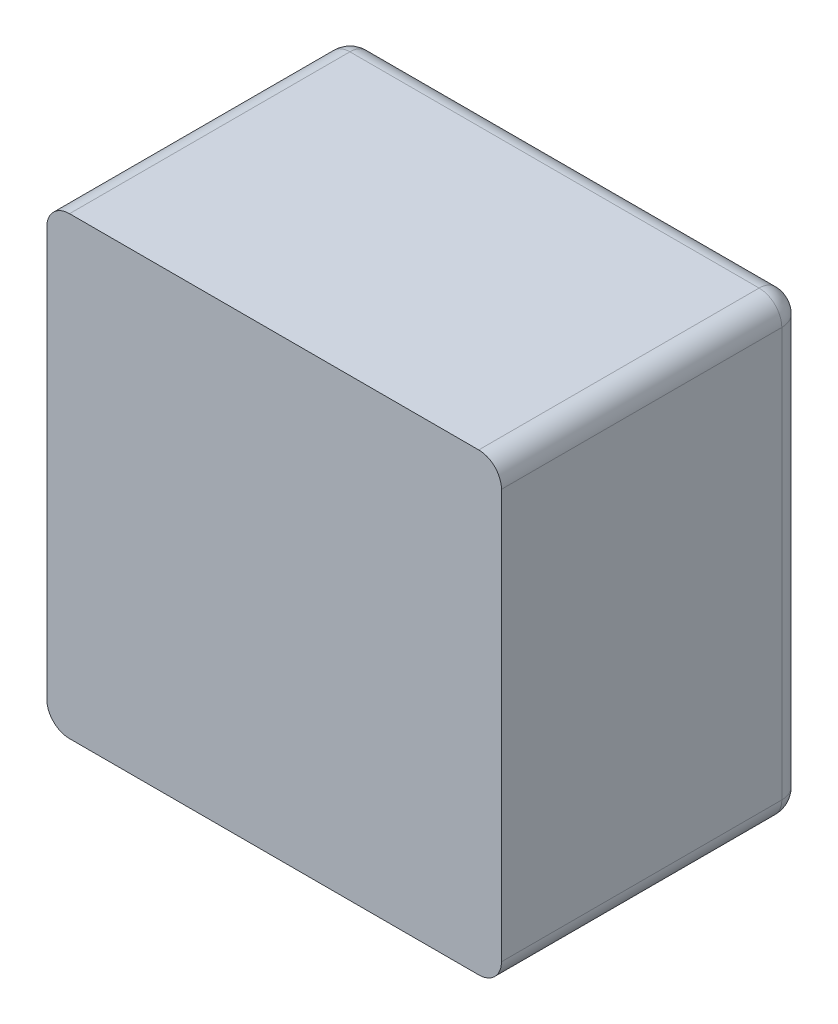
ISO-10303-21;
HEADER;
FILE_DESCRIPTION(('STEP AP214'),'2;1');
FILE_NAME('part.step','',(''),(''),'','','');
FILE_SCHEMA(('AUTOMOTIVE_DESIGN { 1 0 10303 214 1 1 1 1 }'));
ENDSEC;
DATA;
#1=APPLICATION_CONTEXT('core data for automotive mechanical design processes');
#2=APPLICATION_PROTOCOL_DEFINITION('international standard','automotive_design',2000,#1);
#3=PRODUCT_CONTEXT('',#1,'mechanical');
#4=PRODUCT('Part','Part','',(#3));
#5=PRODUCT_RELATED_PRODUCT_CATEGORY('part','',(#4));
#6=PRODUCT_DEFINITION_FORMATION('','',#4);
#7=PRODUCT_DEFINITION_CONTEXT('part definition',#1,'design');
#8=PRODUCT_DEFINITION('design','',#6,#7);
#9=PRODUCT_DEFINITION_SHAPE('','',#8);
#10=(LENGTH_UNIT() NAMED_UNIT(*) SI_UNIT(.MILLI.,.METRE.));
#11=(NAMED_UNIT(*) PLANE_ANGLE_UNIT() SI_UNIT($,.RADIAN.));
#12=(NAMED_UNIT(*) SI_UNIT($,.STERADIAN.) SOLID_ANGLE_UNIT());
#13=UNCERTAINTY_MEASURE_WITH_UNIT(LENGTH_MEASURE(1.E-05),#10,'distance_accuracy_value','');
#14=(GEOMETRIC_REPRESENTATION_CONTEXT(3) GLOBAL_UNCERTAINTY_ASSIGNED_CONTEXT((#13)) GLOBAL_UNIT_ASSIGNED_CONTEXT((#10,
#11,#12)) REPRESENTATION_CONTEXT('',''));
#15=CARTESIAN_POINT('',(0.,0.,0.));
#16=DIRECTION('',(0.,0.,1.));
#17=DIRECTION('',(1.,0.,0.));
#18=AXIS2_PLACEMENT_3D('',#15,#16,#17);
#19=CARTESIAN_POINT('',(-25.,26.5625,40.));
#20=DIRECTION('',(1.,0.,0.));
#21=DIRECTION('',(0.,1.,0.));
#22=AXIS2_PLACEMENT_3D('',#19,#20,#21);
#23=PLANE('',#22);
#24=DIRECTION('',(0.,0.,-1.));
#25=VECTOR('',#24,1.);
#26=CARTESIAN_POINT('',(-25.,23.5625,40.));
#27=LINE('',#26,#25);
#28=CARTESIAN_POINT('',(-25.,23.5625,40.));
#29=VERTEX_POINT('',#28);
#30=CARTESIAN_POINT('',(-25.,23.5625,3.));
#31=VERTEX_POINT('',#30);
#32=EDGE_CURVE('E121',#29,#31,#27,.T.);
#33=ORIENTED_EDGE('',*,*,#32,.T.);
#34=DIRECTION('',(0.,-1.,0.));
#35=VECTOR('',#34,1.);
#36=CARTESIAN_POINT('',(-25.,26.5625,3.));
#37=LINE('',#36,#35);
#38=CARTESIAN_POINT('',(-25.,-30.4375,3.));
#39=VERTEX_POINT('',#38);
#40=EDGE_CURVE('E171',#31,#39,#37,.T.);
#41=ORIENTED_EDGE('',*,*,#40,.T.);
#42=DIRECTION('',(0.,0.,-1.));
#43=VECTOR('',#42,1.);
#44=CARTESIAN_POINT('',(-25.,-30.4375,40.));
#45=LINE('',#44,#43);
#46=CARTESIAN_POINT('',(-25.,-30.4375,40.));
#47=VERTEX_POINT('',#46);
#48=EDGE_CURVE('E148',#39,#47,#45,.F.);
#49=ORIENTED_EDGE('',*,*,#48,.T.);
#50=DIRECTION('',(0.,-1.,0.));
#51=VECTOR('',#50,1.);
#52=CARTESIAN_POINT('',(-25.,26.5625,40.));
#53=LINE('',#52,#51);
#54=EDGE_CURVE('E200',#29,#47,#53,.T.);
#55=ORIENTED_EDGE('',*,*,#54,.F.);
#56=EDGE_LOOP('',(#33,#41,#49,#55));
#57=FACE_BOUND('',#56,.T.);
#58=ADVANCED_FACE('F34',(#57),#23,.F.);
#59=CARTESIAN_POINT('',(-25.,-33.4375,40.));
#60=DIRECTION('',(0.,1.,0.));
#61=DIRECTION('',(0.,0.,1.));
#62=AXIS2_PLACEMENT_3D('',#59,#60,#61);
#63=PLANE('',#62);
#64=DIRECTION('',(0.,0.,-1.));
#65=VECTOR('',#64,1.);
#66=CARTESIAN_POINT('',(-22.,-33.4375,40.));
#67=LINE('',#66,#65);
#68=CARTESIAN_POINT('',(-22.,-33.4375,40.));
#69=VERTEX_POINT('',#68);
#70=CARTESIAN_POINT('',(-22.,-33.4375,3.));
#71=VERTEX_POINT('',#70);
#72=EDGE_CURVE('E133',#69,#71,#67,.T.);
#73=ORIENTED_EDGE('',*,*,#72,.T.);
#74=DIRECTION('',(1.,0.,0.));
#75=VECTOR('',#74,1.);
#76=CARTESIAN_POINT('',(-25.,-33.4375,3.));
#77=LINE('',#76,#75);
#78=CARTESIAN_POINT('',(32.,-33.4375,3.));
#79=VERTEX_POINT('',#78);
#80=EDGE_CURVE('E58',#71,#79,#77,.T.);
#81=ORIENTED_EDGE('',*,*,#80,.T.);
#82=DIRECTION('',(0.,0.,-1.));
#83=VECTOR('',#82,1.);
#84=CARTESIAN_POINT('',(32.,-33.4375,40.));
#85=LINE('',#84,#83);
#86=CARTESIAN_POINT('',(32.,-33.4375,40.));
#87=VERTEX_POINT('',#86);
#88=EDGE_CURVE('E135',#79,#87,#85,.F.);
#89=ORIENTED_EDGE('',*,*,#88,.T.);
#90=DIRECTION('',(1.,0.,0.));
#91=VECTOR('',#90,1.);
#92=CARTESIAN_POINT('',(-25.,-33.4375,40.));
#93=LINE('',#92,#91);
#94=EDGE_CURVE('E120',#69,#87,#93,.T.);
#95=ORIENTED_EDGE('',*,*,#94,.F.);
#96=EDGE_LOOP('',(#73,#81,#89,#95));
#97=FACE_BOUND('',#96,.T.);
#98=ADVANCED_FACE('F258',(#97),#63,.F.);
#99=CARTESIAN_POINT('',(35.,26.5625,40.));
#100=DIRECTION('',(-1.,0.,0.));
#101=DIRECTION('',(0.,-1.,0.));
#102=AXIS2_PLACEMENT_3D('',#99,#100,#101);
#103=PLANE('',#102);
#104=DIRECTION('',(0.,0.,-1.));
#105=VECTOR('',#104,1.);
#106=CARTESIAN_POINT('',(35.,-30.4375,40.));
#107=LINE('',#106,#105);
#108=CARTESIAN_POINT('',(35.,-30.4375,40.));
#109=VERTEX_POINT('',#108);
#110=CARTESIAN_POINT('',(35.,-30.4375,3.));
#111=VERTEX_POINT('',#110);
#112=EDGE_CURVE('E126',#109,#111,#107,.T.);
#113=ORIENTED_EDGE('',*,*,#112,.T.);
#114=DIRECTION('',(0.,1.,0.));
#115=VECTOR('',#114,1.);
#116=CARTESIAN_POINT('',(35.,26.5625,3.));
#117=LINE('',#116,#115);
#118=CARTESIAN_POINT('',(35.,23.5625,3.));
#119=VERTEX_POINT('',#118);
#120=EDGE_CURVE('E11',#111,#119,#117,.T.);
#121=ORIENTED_EDGE('',*,*,#120,.T.);
#122=DIRECTION('',(0.,0.,-1.));
#123=VECTOR('',#122,1.);
#124=CARTESIAN_POINT('',(35.,23.5625,40.));
#125=LINE('',#124,#123);
#126=CARTESIAN_POINT('',(35.,23.5625,40.));
#127=VERTEX_POINT('',#126);
#128=EDGE_CURVE('E129',#119,#127,#125,.F.);
#129=ORIENTED_EDGE('',*,*,#128,.T.);
#130=DIRECTION('',(0.,1.,0.));
#131=VECTOR('',#130,1.);
#132=CARTESIAN_POINT('',(35.,26.5625,40.));
#133=LINE('',#132,#131);
#134=EDGE_CURVE('E117',#109,#127,#133,.T.);
#135=ORIENTED_EDGE('',*,*,#134,.F.);
#136=EDGE_LOOP('',(#113,#121,#129,#135));
#137=FACE_BOUND('',#136,.T.);
#138=ADVANCED_FACE('F125',(#137),#103,.F.);
#139=CARTESIAN_POINT('',(-25.,26.5625,40.));
#140=DIRECTION('',(0.,-1.,0.));
#141=DIRECTION('',(0.,0.,-1.));
#142=AXIS2_PLACEMENT_3D('',#139,#140,#141);
#143=PLANE('',#142);
#144=DIRECTION('',(0.,0.,-1.));
#145=VECTOR('',#144,1.);
#146=CARTESIAN_POINT('',(32.,26.5625,40.));
#147=LINE('',#146,#145);
#148=CARTESIAN_POINT('',(32.,26.5625,40.));
#149=VERTEX_POINT('',#148);
#150=CARTESIAN_POINT('',(32.,26.5625,3.));
#151=VERTEX_POINT('',#150);
#152=EDGE_CURVE('E150',#149,#151,#147,.T.);
#153=ORIENTED_EDGE('',*,*,#152,.T.);
#154=DIRECTION('',(-1.,0.,0.));
#155=VECTOR('',#154,1.);
#156=CARTESIAN_POINT('',(-25.,26.5625,3.));
#157=LINE('',#156,#155);
#158=CARTESIAN_POINT('',(-22.,26.5625,3.));
#159=VERTEX_POINT('',#158);
#160=EDGE_CURVE('E158',#151,#159,#157,.T.);
#161=ORIENTED_EDGE('',*,*,#160,.T.);
#162=DIRECTION('',(0.,0.,-1.));
#163=VECTOR('',#162,1.);
#164=CARTESIAN_POINT('',(-22.,26.5625,40.));
#165=LINE('',#164,#163);
#166=CARTESIAN_POINT('',(-22.,26.5625,40.));
#167=VERTEX_POINT('',#166);
#168=EDGE_CURVE('E153',#159,#167,#165,.F.);
#169=ORIENTED_EDGE('',*,*,#168,.T.);
#170=DIRECTION('',(-1.,0.,0.));
#171=VECTOR('',#170,1.);
#172=CARTESIAN_POINT('',(-25.,26.5625,40.));
#173=LINE('',#172,#171);
#174=EDGE_CURVE('E130',#149,#167,#173,.T.);
#175=ORIENTED_EDGE('',*,*,#174,.F.);
#176=EDGE_LOOP('',(#153,#161,#169,#175));
#177=FACE_BOUND('',#176,.T.);
#178=ADVANCED_FACE('F250',(#177),#143,.F.);
#179=CARTESIAN_POINT('',(0.,0.,40.));
#180=DIRECTION('',(0.,0.,1.));
#181=DIRECTION('',(1.,0.,0.));
#182=AXIS2_PLACEMENT_3D('',#179,#180,#181);
#183=PLANE('',#182);
#184=ORIENTED_EDGE('',*,*,#94,.T.);
#185=CARTESIAN_POINT('',(32.,-30.4375,40.));
#186=DIRECTION('',(0.,0.,1.));
#187=DIRECTION('',(1.,0.,0.));
#188=AXIS2_PLACEMENT_3D('',#185,#186,#187);
#189=CIRCLE('',#188,3.);
#190=EDGE_CURVE('E114',#87,#109,#189,.T.);
#191=ORIENTED_EDGE('',*,*,#190,.T.);
#192=ORIENTED_EDGE('',*,*,#134,.T.);
#193=CARTESIAN_POINT('',(32.,23.5625,40.));
#194=DIRECTION('',(0.,0.,1.));
#195=DIRECTION('',(1.,0.,0.));
#196=AXIS2_PLACEMENT_3D('',#193,#194,#195);
#197=CIRCLE('',#196,3.);
#198=EDGE_CURVE('E141',#127,#149,#197,.T.);
#199=ORIENTED_EDGE('',*,*,#198,.T.);
#200=ORIENTED_EDGE('',*,*,#174,.T.);
#201=CARTESIAN_POINT('',(-22.,23.5625,40.));
#202=DIRECTION('',(0.,0.,1.));
#203=DIRECTION('',(1.,0.,0.));
#204=AXIS2_PLACEMENT_3D('',#201,#202,#203);
#205=CIRCLE('',#204,3.);
#206=EDGE_CURVE('E143',#167,#29,#205,.T.);
#207=ORIENTED_EDGE('',*,*,#206,.T.);
#208=ORIENTED_EDGE('',*,*,#54,.T.);
#209=CARTESIAN_POINT('',(-22.,-30.4375,40.));
#210=DIRECTION('',(0.,0.,1.));
#211=DIRECTION('',(1.,0.,0.));
#212=AXIS2_PLACEMENT_3D('',#209,#210,#211);
#213=CIRCLE('',#212,3.);
#214=EDGE_CURVE('E122',#47,#69,#213,.T.);
#215=ORIENTED_EDGE('',*,*,#214,.T.);
#216=EDGE_LOOP('',(#184,#191,#192,#199,#200,#207,#208,#215));
#217=FACE_BOUND('',#216,.T.);
#218=ADVANCED_FACE('F116',(#217),#183,.T.);
#219=CARTESIAN_POINT('',(0.,0.,0.));
#220=DIRECTION('',(0.,0.,1.));
#221=DIRECTION('',(1.,0.,0.));
#222=AXIS2_PLACEMENT_3D('',#219,#220,#221);
#223=PLANE('',#222);
#224=CARTESIAN_POINT('',(5.00000000000002,-3.4375,0.));
#225=DIRECTION('',(0.,0.,-1.));
#226=DIRECTION('',(-1.,0.,0.));
#227=AXIS2_PLACEMENT_3D('',#224,#225,#226);
#228=CIRCLE('',#227,20.);
#229=CARTESIAN_POINT('',(-15.,-3.4375,0.));
#230=VERTEX_POINT('',#229);
#231=EDGE_CURVE('E210',#230,#230,#228,.T.);
#232=ORIENTED_EDGE('',*,*,#231,.F.);
#233=EDGE_LOOP('',(#232));
#234=FACE_BOUND('',#233,.T.);
#235=DIRECTION('',(0.,-1.,0.));
#236=VECTOR('',#235,1.);
#237=CARTESIAN_POINT('',(-22.,0.,0.));
#238=LINE('',#237,#236);
#239=CARTESIAN_POINT('',(-22.,-30.4375,0.));
#240=VERTEX_POINT('',#239);
#241=CARTESIAN_POINT('',(-22.,23.5625,0.));
#242=VERTEX_POINT('',#241);
#243=EDGE_CURVE('E164',#240,#242,#238,.F.);
#244=ORIENTED_EDGE('',*,*,#243,.T.);
#245=DIRECTION('',(-1.,0.,0.));
#246=VECTOR('',#245,1.);
#247=CARTESIAN_POINT('',(0.,23.5625,0.));
#248=LINE('',#247,#246);
#249=CARTESIAN_POINT('',(32.,23.5625,0.));
#250=VERTEX_POINT('',#249);
#251=EDGE_CURVE('E166',#242,#250,#248,.F.);
#252=ORIENTED_EDGE('',*,*,#251,.T.);
#253=DIRECTION('',(0.,1.,0.));
#254=VECTOR('',#253,1.);
#255=CARTESIAN_POINT('',(32.,0.,0.));
#256=LINE('',#255,#254);
#257=CARTESIAN_POINT('',(32.,-30.4375,0.));
#258=VERTEX_POINT('',#257);
#259=EDGE_CURVE('E160',#250,#258,#256,.F.);
#260=ORIENTED_EDGE('',*,*,#259,.T.);
#261=DIRECTION('',(1.,0.,0.));
#262=VECTOR('',#261,1.);
#263=CARTESIAN_POINT('',(0.,-30.4375,0.));
#264=LINE('',#263,#262);
#265=EDGE_CURVE('E162',#258,#240,#264,.F.);
#266=ORIENTED_EDGE('',*,*,#265,.T.);
#267=EDGE_LOOP('',(#244,#252,#260,#266));
#268=FACE_BOUND('',#267,.T.);
#269=ADVANCED_FACE('F236',(#234,#268),#223,.F.);
#270=CARTESIAN_POINT('',(32.,-30.4375,40.));
#271=DIRECTION('',(0.,0.,-1.));
#272=DIRECTION('',(-1.,0.,0.));
#273=AXIS2_PLACEMENT_3D('',#270,#271,#272);
#274=CYLINDRICAL_SURFACE('',#273,3.);
#275=ORIENTED_EDGE('',*,*,#88,.F.);
#276=CARTESIAN_POINT('',(32.,-30.4375,3.));
#277=DIRECTION('',(0.,0.,-1.));
#278=DIRECTION('',(-1.,0.,0.));
#279=AXIS2_PLACEMENT_3D('',#276,#277,#278);
#280=CIRCLE('',#279,3.);
#281=EDGE_CURVE('E43',#79,#111,#280,.F.);
#282=ORIENTED_EDGE('',*,*,#281,.T.);
#283=ORIENTED_EDGE('',*,*,#112,.F.);
#284=ORIENTED_EDGE('',*,*,#190,.F.);
#285=EDGE_LOOP('',(#275,#282,#283,#284));
#286=FACE_BOUND('',#285,.T.);
#287=ADVANCED_FACE('F132',(#286),#274,.T.);
#288=CARTESIAN_POINT('',(-22.,-30.4375,40.));
#289=DIRECTION('',(0.,0.,-1.));
#290=DIRECTION('',(-1.,0.,0.));
#291=AXIS2_PLACEMENT_3D('',#288,#289,#290);
#292=CYLINDRICAL_SURFACE('',#291,3.);
#293=ORIENTED_EDGE('',*,*,#48,.F.);
#294=CARTESIAN_POINT('',(-22.,-30.4375,3.));
#295=DIRECTION('',(0.,0.,-1.));
#296=DIRECTION('',(-1.,0.,0.));
#297=AXIS2_PLACEMENT_3D('',#294,#295,#296);
#298=CIRCLE('',#297,3.);
#299=EDGE_CURVE('E173',#39,#71,#298,.F.);
#300=ORIENTED_EDGE('',*,*,#299,.T.);
#301=ORIENTED_EDGE('',*,*,#72,.F.);
#302=ORIENTED_EDGE('',*,*,#214,.F.);
#303=EDGE_LOOP('',(#293,#300,#301,#302));
#304=FACE_BOUND('',#303,.T.);
#305=ADVANCED_FACE('F270',(#304),#292,.T.);
#306=CARTESIAN_POINT('',(-22.,23.5625,40.));
#307=DIRECTION('',(0.,0.,-1.));
#308=DIRECTION('',(-1.,0.,0.));
#309=AXIS2_PLACEMENT_3D('',#306,#307,#308);
#310=CYLINDRICAL_SURFACE('',#309,3.);
#311=ORIENTED_EDGE('',*,*,#168,.F.);
#312=CARTESIAN_POINT('',(-22.,23.5625,3.));
#313=DIRECTION('',(0.,0.,-1.));
#314=DIRECTION('',(-1.,0.,0.));
#315=AXIS2_PLACEMENT_3D('',#312,#313,#314);
#316=CIRCLE('',#315,3.);
#317=EDGE_CURVE('E169',#159,#31,#316,.F.);
#318=ORIENTED_EDGE('',*,*,#317,.T.);
#319=ORIENTED_EDGE('',*,*,#32,.F.);
#320=ORIENTED_EDGE('',*,*,#206,.F.);
#321=EDGE_LOOP('',(#311,#318,#319,#320));
#322=FACE_BOUND('',#321,.T.);
#323=ADVANCED_FACE('F220',(#322),#310,.T.);
#324=CARTESIAN_POINT('',(32.,23.5625,40.));
#325=DIRECTION('',(0.,0.,-1.));
#326=DIRECTION('',(-1.,0.,0.));
#327=AXIS2_PLACEMENT_3D('',#324,#325,#326);
#328=CYLINDRICAL_SURFACE('',#327,3.);
#329=ORIENTED_EDGE('',*,*,#128,.F.);
#330=CARTESIAN_POINT('',(32.,23.5625,3.));
#331=DIRECTION('',(0.,0.,-1.));
#332=DIRECTION('',(-1.,0.,0.));
#333=AXIS2_PLACEMENT_3D('',#330,#331,#332);
#334=CIRCLE('',#333,3.);
#335=EDGE_CURVE('E155',#119,#151,#334,.F.);
#336=ORIENTED_EDGE('',*,*,#335,.T.);
#337=ORIENTED_EDGE('',*,*,#152,.F.);
#338=ORIENTED_EDGE('',*,*,#198,.F.);
#339=EDGE_LOOP('',(#329,#336,#337,#338));
#340=FACE_BOUND('',#339,.T.);
#341=ADVANCED_FACE('F247',(#340),#328,.T.);
#342=CARTESIAN_POINT('',(-22.,-30.4375,3.));
#343=DIRECTION('',(0.,0.,1.));
#344=DIRECTION('',(1.,0.,0.));
#345=AXIS2_PLACEMENT_3D('',#342,#343,#344);
#346=SPHERICAL_SURFACE('',#345,3.);
#347=CARTESIAN_POINT('',(-22.,-30.4375,3.));
#348=DIRECTION('',(1.,0.,0.));
#349=DIRECTION('',(0.,0.,-1.));
#350=AXIS2_PLACEMENT_3D('',#347,#348,#349);
#351=CIRCLE('',#350,3.);
#352=EDGE_CURVE('E193',#71,#240,#351,.T.);
#353=ORIENTED_EDGE('',*,*,#352,.F.);
#354=ORIENTED_EDGE('',*,*,#299,.F.);
#355=CARTESIAN_POINT('',(-22.,-30.4375,3.));
#356=DIRECTION('',(0.,1.,0.));
#357=DIRECTION('',(0.,0.,1.));
#358=AXIS2_PLACEMENT_3D('',#355,#356,#357);
#359=CIRCLE('',#358,3.);
#360=EDGE_CURVE('E38',#240,#39,#359,.T.);
#361=ORIENTED_EDGE('',*,*,#360,.F.);
#362=EDGE_LOOP('',(#353,#354,#361));
#363=FACE_BOUND('',#362,.T.);
#364=ADVANCED_FACE('F36',(#363),#346,.T.);
#365=CARTESIAN_POINT('',(-22.,26.5625,3.));
#366=DIRECTION('',(0.,-1.,0.));
#367=DIRECTION('',(1.,0.,0.));
#368=AXIS2_PLACEMENT_3D('',#365,#366,#367);
#369=CYLINDRICAL_SURFACE('',#368,3.);
#370=ORIENTED_EDGE('',*,*,#360,.T.);
#371=ORIENTED_EDGE('',*,*,#40,.F.);
#372=CARTESIAN_POINT('',(-22.,23.5625,3.));
#373=DIRECTION('',(0.,1.,0.));
#374=DIRECTION('',(0.,0.,1.));
#375=AXIS2_PLACEMENT_3D('',#372,#373,#374);
#376=CIRCLE('',#375,3.);
#377=EDGE_CURVE('E191',#242,#31,#376,.T.);
#378=ORIENTED_EDGE('',*,*,#377,.F.);
#379=ORIENTED_EDGE('',*,*,#243,.F.);
#380=EDGE_LOOP('',(#370,#371,#378,#379));
#381=FACE_BOUND('',#380,.T.);
#382=ADVANCED_FACE('F225',(#381),#369,.T.);
#383=CARTESIAN_POINT('',(-25.,-30.4375,3.));
#384=DIRECTION('',(1.,0.,0.));
#385=DIRECTION('',(0.,0.,-1.));
#386=AXIS2_PLACEMENT_3D('',#383,#384,#385);
#387=CYLINDRICAL_SURFACE('',#386,3.);
#388=ORIENTED_EDGE('',*,*,#352,.T.);
#389=ORIENTED_EDGE('',*,*,#265,.F.);
#390=CARTESIAN_POINT('',(32.,-30.4375,3.));
#391=DIRECTION('',(1.,0.,0.));
#392=DIRECTION('',(0.,0.,-1.));
#393=AXIS2_PLACEMENT_3D('',#390,#391,#392);
#394=CIRCLE('',#393,3.);
#395=EDGE_CURVE('E188',#79,#258,#394,.T.);
#396=ORIENTED_EDGE('',*,*,#395,.F.);
#397=ORIENTED_EDGE('',*,*,#80,.F.);
#398=EDGE_LOOP('',(#388,#389,#396,#397));
#399=FACE_BOUND('',#398,.T.);
#400=ADVANCED_FACE('F238',(#399),#387,.T.);
#401=CARTESIAN_POINT('',(-22.,23.5625,3.));
#402=DIRECTION('',(0.,0.,1.));
#403=DIRECTION('',(1.,0.,0.));
#404=AXIS2_PLACEMENT_3D('',#401,#402,#403);
#405=SPHERICAL_SURFACE('',#404,3.);
#406=ORIENTED_EDGE('',*,*,#377,.T.);
#407=ORIENTED_EDGE('',*,*,#317,.F.);
#408=CARTESIAN_POINT('',(-22.,23.5625,3.));
#409=DIRECTION('',(1.,0.,0.));
#410=DIRECTION('',(0.,0.,-1.));
#411=AXIS2_PLACEMENT_3D('',#408,#409,#410);
#412=CIRCLE('',#411,3.);
#413=EDGE_CURVE('E185',#242,#159,#412,.T.);
#414=ORIENTED_EDGE('',*,*,#413,.F.);
#415=EDGE_LOOP('',(#406,#407,#414));
#416=FACE_BOUND('',#415,.T.);
#417=ADVANCED_FACE('F228',(#416),#405,.T.);
#418=CARTESIAN_POINT('',(32.,-30.4375,3.));
#419=DIRECTION('',(0.,0.,1.));
#420=DIRECTION('',(1.,0.,0.));
#421=AXIS2_PLACEMENT_3D('',#418,#419,#420);
#422=SPHERICAL_SURFACE('',#421,3.);
#423=ORIENTED_EDGE('',*,*,#281,.F.);
#424=ORIENTED_EDGE('',*,*,#395,.T.);
#425=CARTESIAN_POINT('',(32.,-30.4375,3.));
#426=DIRECTION('',(0.,1.,0.));
#427=DIRECTION('',(0.,0.,1.));
#428=AXIS2_PLACEMENT_3D('',#425,#426,#427);
#429=CIRCLE('',#428,3.);
#430=EDGE_CURVE('E182',#111,#258,#429,.T.);
#431=ORIENTED_EDGE('',*,*,#430,.F.);
#432=EDGE_LOOP('',(#423,#424,#431));
#433=FACE_BOUND('',#432,.T.);
#434=ADVANCED_FACE('F240',(#433),#422,.T.);
#435=CARTESIAN_POINT('',(-25.,23.5625,3.));
#436=DIRECTION('',(-1.,0.,0.));
#437=DIRECTION('',(0.,0.,1.));
#438=AXIS2_PLACEMENT_3D('',#435,#436,#437);
#439=CYLINDRICAL_SURFACE('',#438,3.);
#440=ORIENTED_EDGE('',*,*,#413,.T.);
#441=ORIENTED_EDGE('',*,*,#160,.F.);
#442=CARTESIAN_POINT('',(32.,23.5625,3.));
#443=DIRECTION('',(1.,0.,0.));
#444=DIRECTION('',(0.,0.,-1.));
#445=AXIS2_PLACEMENT_3D('',#442,#443,#444);
#446=CIRCLE('',#445,3.);
#447=EDGE_CURVE('E179',#250,#151,#446,.T.);
#448=ORIENTED_EDGE('',*,*,#447,.F.);
#449=ORIENTED_EDGE('',*,*,#251,.F.);
#450=EDGE_LOOP('',(#440,#441,#448,#449));
#451=FACE_BOUND('',#450,.T.);
#452=ADVANCED_FACE('F233',(#451),#439,.T.);
#453=CARTESIAN_POINT('',(32.,26.5625,3.));
#454=DIRECTION('',(0.,1.,0.));
#455=DIRECTION('',(-1.,0.,0.));
#456=AXIS2_PLACEMENT_3D('',#453,#454,#455);
#457=CYLINDRICAL_SURFACE('',#456,3.);
#458=ORIENTED_EDGE('',*,*,#430,.T.);
#459=ORIENTED_EDGE('',*,*,#259,.F.);
#460=CARTESIAN_POINT('',(32.,23.5625,3.));
#461=DIRECTION('',(0.,1.,0.));
#462=DIRECTION('',(0.,0.,1.));
#463=AXIS2_PLACEMENT_3D('',#460,#461,#462);
#464=CIRCLE('',#463,3.);
#465=EDGE_CURVE('E177',#119,#250,#464,.T.);
#466=ORIENTED_EDGE('',*,*,#465,.F.);
#467=ORIENTED_EDGE('',*,*,#120,.F.);
#468=EDGE_LOOP('',(#458,#459,#466,#467));
#469=FACE_BOUND('',#468,.T.);
#470=ADVANCED_FACE('F243',(#469),#457,.T.);
#471=CARTESIAN_POINT('',(32.,23.5625,3.));
#472=DIRECTION('',(0.,0.,1.));
#473=DIRECTION('',(1.,0.,0.));
#474=AXIS2_PLACEMENT_3D('',#471,#472,#473);
#475=SPHERICAL_SURFACE('',#474,3.);
#476=ORIENTED_EDGE('',*,*,#447,.T.);
#477=ORIENTED_EDGE('',*,*,#335,.F.);
#478=ORIENTED_EDGE('',*,*,#465,.T.);
#479=EDGE_LOOP('',(#476,#477,#478));
#480=FACE_BOUND('',#479,.T.);
#481=ADVANCED_FACE('F249',(#480),#475,.T.);
#482=CARTESIAN_POINT('',(5.00000000000002,-3.4375,1.));
#483=DIRECTION('',(0.,0.,-1.));
#484=DIRECTION('',(-1.,0.,0.));
#485=AXIS2_PLACEMENT_3D('',#482,#483,#484);
#486=CYLINDRICAL_SURFACE('',#485,20.);
#487=CARTESIAN_POINT('',(5.00000000000002,-3.4375,1.));
#488=DIRECTION('',(0.,0.,-1.));
#489=DIRECTION('',(-1.,0.,0.));
#490=AXIS2_PLACEMENT_3D('',#487,#488,#489);
#491=CIRCLE('',#490,20.);
#492=CARTESIAN_POINT('',(-15.,-3.4375,1.));
#493=VERTEX_POINT('',#492);
#494=EDGE_CURVE('E180',#493,#493,#491,.T.);
#495=ORIENTED_EDGE('',*,*,#494,.F.);
#496=EDGE_LOOP('',(#495));
#497=FACE_BOUND('',#496,.T.);
#498=ORIENTED_EDGE('',*,*,#231,.T.);
#499=EDGE_LOOP('',(#498));
#500=FACE_BOUND('',#499,.T.);
#501=ADVANCED_FACE('F280',(#497,#500),#486,.F.);
#502=CARTESIAN_POINT('',(5.00000000000002,-3.4375,1.));
#503=DIRECTION('',(0.,0.,-1.));
#504=DIRECTION('',(-1.,0.,0.));
#505=AXIS2_PLACEMENT_3D('',#502,#503,#504);
#506=PLANE('',#505);
#507=ORIENTED_EDGE('',*,*,#494,.T.);
#508=EDGE_LOOP('',(#507));
#509=FACE_BOUND('',#508,.T.);
#510=ADVANCED_FACE('F409',(#509),#506,.T.);
#511=CLOSED_SHELL('',(#58,#98,#138,#178,#218,#269,#287,#305,#323,#341,#364,#382,#400,#417,#434,
#452,#470,#481,#501,#510));
#512=MANIFOLD_SOLID_BREP('B2',#511);
#513=ADVANCED_BREP_SHAPE_REPRESENTATION('',(#18,#512),#14);
#514=SHAPE_DEFINITION_REPRESENTATION(#9,#513);
ENDSEC;
END-ISO-10303-21;
